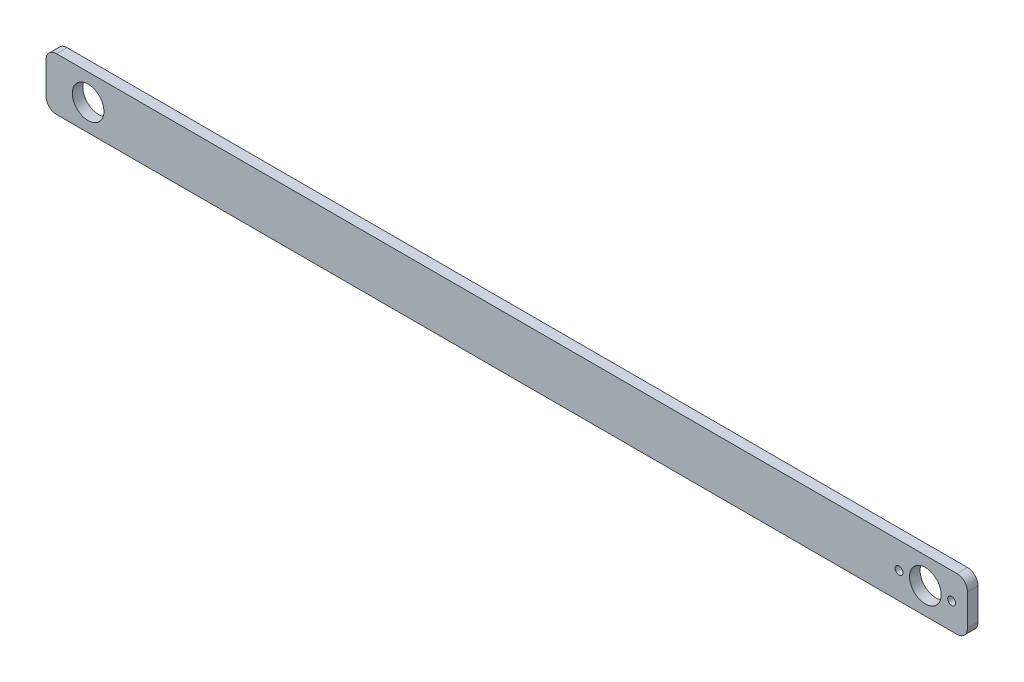
ISO-10303-21;
HEADER;
FILE_DESCRIPTION(('STEP AP214'),'2;1');
FILE_NAME('part.step','',(''),(''),'','','');
FILE_SCHEMA(('AUTOMOTIVE_DESIGN { 1 0 10303 214 1 1 1 1 }'));
ENDSEC;
DATA;
#1=APPLICATION_CONTEXT('core data for automotive mechanical design processes');
#2=APPLICATION_PROTOCOL_DEFINITION('international standard','automotive_design',2000,#1);
#3=PRODUCT_CONTEXT('',#1,'mechanical');
#4=PRODUCT('Part','Part','',(#3));
#5=PRODUCT_RELATED_PRODUCT_CATEGORY('part','',(#4));
#6=PRODUCT_DEFINITION_FORMATION('','',#4);
#7=PRODUCT_DEFINITION_CONTEXT('part definition',#1,'design');
#8=PRODUCT_DEFINITION('design','',#6,#7);
#9=PRODUCT_DEFINITION_SHAPE('','',#8);
#10=(LENGTH_UNIT() NAMED_UNIT(*) SI_UNIT(.MILLI.,.METRE.));
#11=(NAMED_UNIT(*) PLANE_ANGLE_UNIT() SI_UNIT($,.RADIAN.));
#12=(NAMED_UNIT(*) SI_UNIT($,.STERADIAN.) SOLID_ANGLE_UNIT());
#13=UNCERTAINTY_MEASURE_WITH_UNIT(LENGTH_MEASURE(1.E-05),#10,'distance_accuracy_value','');
#14=(GEOMETRIC_REPRESENTATION_CONTEXT(3) GLOBAL_UNCERTAINTY_ASSIGNED_CONTEXT((#13)) GLOBAL_UNIT_ASSIGNED_CONTEXT((#10,
#11,#12)) REPRESENTATION_CONTEXT('',''));
#15=CARTESIAN_POINT('',(0.,0.,0.));
#16=DIRECTION('',(0.,0.,1.));
#17=DIRECTION('',(1.,0.,0.));
#18=AXIS2_PLACEMENT_3D('',#15,#16,#17);
#19=CARTESIAN_POINT('',(-170.,-1.04083408558608E-13,2.));
#20=DIRECTION('',(1.,0.,0.));
#21=DIRECTION('',(0.,0.,-1.));
#22=AXIS2_PLACEMENT_3D('',#19,#20,#21);
#23=PLANE('',#22);
#24=DIRECTION('',(0.,-1.,0.));
#25=VECTOR('',#24,1.);
#26=CARTESIAN_POINT('',(-170.,-1.04083408558608E-13,0.));
#27=LINE('',#26,#25);
#28=CARTESIAN_POINT('',(-170.,-2.0000000000001,0.));
#29=VERTEX_POINT('',#28);
#30=CARTESIAN_POINT('',(-170.,-8.00000000000011,0.));
#31=VERTEX_POINT('',#30);
#32=EDGE_CURVE('E201',#29,#31,#27,.T.);
#33=ORIENTED_EDGE('',*,*,#32,.T.);
#34=DIRECTION('',(0.,0.,-1.));
#35=VECTOR('',#34,1.);
#36=CARTESIAN_POINT('',(-170.,-8.00000000000011,2.));
#37=LINE('',#36,#35);
#38=CARTESIAN_POINT('',(-170.,-8.00000000000011,2.));
#39=VERTEX_POINT('',#38);
#40=EDGE_CURVE('E11',#31,#39,#37,.F.);
#41=ORIENTED_EDGE('',*,*,#40,.T.);
#42=DIRECTION('',(0.,-1.,0.));
#43=VECTOR('',#42,1.);
#44=CARTESIAN_POINT('',(-170.,-1.04083408558608E-13,2.));
#45=LINE('',#44,#43);
#46=CARTESIAN_POINT('',(-170.,-2.0000000000001,2.));
#47=VERTEX_POINT('',#46);
#48=EDGE_CURVE('E134',#47,#39,#45,.T.);
#49=ORIENTED_EDGE('',*,*,#48,.F.);
#50=DIRECTION('',(0.,0.,-1.));
#51=VECTOR('',#50,1.);
#52=CARTESIAN_POINT('',(-170.,-2.0000000000001,2.));
#53=LINE('',#52,#51);
#54=EDGE_CURVE('E47',#47,#29,#53,.T.);
#55=ORIENTED_EDGE('',*,*,#54,.T.);
#56=EDGE_LOOP('',(#33,#41,#49,#55));
#57=FACE_BOUND('',#56,.T.);
#58=ADVANCED_FACE('F38',(#57),#23,.F.);
#59=CARTESIAN_POINT('',(-170.,-10.0000000000001,2.));
#60=DIRECTION('',(0.,1.,0.));
#61=DIRECTION('',(-1.,0.,0.));
#62=AXIS2_PLACEMENT_3D('',#59,#60,#61);
#63=PLANE('',#62);
#64=DIRECTION('',(1.,0.,0.));
#65=VECTOR('',#64,1.);
#66=CARTESIAN_POINT('',(-170.,-10.0000000000001,0.));
#67=LINE('',#66,#65);
#68=CARTESIAN_POINT('',(-168.,-10.0000000000001,0.));
#69=VERTEX_POINT('',#68);
#70=CARTESIAN_POINT('',(2.99999999999998,-10.0000000000001,0.));
#71=VERTEX_POINT('',#70);
#72=EDGE_CURVE('E142',#69,#71,#67,.T.);
#73=ORIENTED_EDGE('',*,*,#72,.T.);
#74=DIRECTION('',(0.,0.,-1.));
#75=VECTOR('',#74,1.);
#76=CARTESIAN_POINT('',(2.99999999999998,-10.0000000000001,2.));
#77=LINE('',#76,#75);
#78=CARTESIAN_POINT('',(2.99999999999998,-10.0000000000001,2.));
#79=VERTEX_POINT('',#78);
#80=EDGE_CURVE('E54',#71,#79,#77,.F.);
#81=ORIENTED_EDGE('',*,*,#80,.T.);
#82=DIRECTION('',(1.,0.,0.));
#83=VECTOR('',#82,1.);
#84=CARTESIAN_POINT('',(-170.,-10.0000000000001,2.));
#85=LINE('',#84,#83);
#86=CARTESIAN_POINT('',(-168.,-10.0000000000001,2.));
#87=VERTEX_POINT('',#86);
#88=EDGE_CURVE('E140',#87,#79,#85,.T.);
#89=ORIENTED_EDGE('',*,*,#88,.F.);
#90=DIRECTION('',(0.,0.,-1.));
#91=VECTOR('',#90,1.);
#92=CARTESIAN_POINT('',(-168.,-10.0000000000001,2.));
#93=LINE('',#92,#91);
#94=EDGE_CURVE('E189',#87,#69,#93,.T.);
#95=ORIENTED_EDGE('',*,*,#94,.T.);
#96=EDGE_LOOP('',(#73,#81,#89,#95));
#97=FACE_BOUND('',#96,.T.);
#98=ADVANCED_FACE('F253',(#97),#63,.F.);
#99=CARTESIAN_POINT('',(4.99999999999997,0.,2.));
#100=DIRECTION('',(-1.,0.,0.));
#101=DIRECTION('',(0.,-1.,0.));
#102=AXIS2_PLACEMENT_3D('',#99,#100,#101);
#103=PLANE('',#102);
#104=DIRECTION('',(0.,1.,0.));
#105=VECTOR('',#104,1.);
#106=CARTESIAN_POINT('',(4.99999999999997,0.,0.));
#107=LINE('',#106,#105);
#108=CARTESIAN_POINT('',(4.99999999999998,-8.00000000000005,0.));
#109=VERTEX_POINT('',#108);
#110=CARTESIAN_POINT('',(4.99999999999998,-2.00000000000005,0.));
#111=VERTEX_POINT('',#110);
#112=EDGE_CURVE('E135',#109,#111,#107,.T.);
#113=ORIENTED_EDGE('',*,*,#112,.T.);
#114=DIRECTION('',(0.,0.,-1.));
#115=VECTOR('',#114,1.);
#116=CARTESIAN_POINT('',(4.99999999999998,-2.00000000000005,2.));
#117=LINE('',#116,#115);
#118=CARTESIAN_POINT('',(4.99999999999998,-2.00000000000005,2.));
#119=VERTEX_POINT('',#118);
#120=EDGE_CURVE('E110',#111,#119,#117,.F.);
#121=ORIENTED_EDGE('',*,*,#120,.T.);
#122=DIRECTION('',(0.,1.,0.));
#123=VECTOR('',#122,1.);
#124=CARTESIAN_POINT('',(4.99999999999997,0.,2.));
#125=LINE('',#124,#123);
#126=CARTESIAN_POINT('',(4.99999999999998,-8.00000000000005,2.));
#127=VERTEX_POINT('',#126);
#128=EDGE_CURVE('E216',#127,#119,#125,.T.);
#129=ORIENTED_EDGE('',*,*,#128,.F.);
#130=DIRECTION('',(0.,0.,-1.));
#131=VECTOR('',#130,1.);
#132=CARTESIAN_POINT('',(4.99999999999998,-8.00000000000005,2.));
#133=LINE('',#132,#131);
#134=EDGE_CURVE('E116',#127,#109,#133,.T.);
#135=ORIENTED_EDGE('',*,*,#134,.T.);
#136=EDGE_LOOP('',(#113,#121,#129,#135));
#137=FACE_BOUND('',#136,.T.);
#138=ADVANCED_FACE('F250',(#137),#103,.F.);
#139=CARTESIAN_POINT('',(-170.,-1.04083408558608E-13,2.));
#140=DIRECTION('',(0.,-1.,0.));
#141=DIRECTION('',(1.,0.,0.));
#142=AXIS2_PLACEMENT_3D('',#139,#140,#141);
#143=PLANE('',#142);
#144=DIRECTION('',(-1.,0.,0.));
#145=VECTOR('',#144,1.);
#146=CARTESIAN_POINT('',(-170.,-1.04083408558608E-13,2.));
#147=LINE('',#146,#145);
#148=CARTESIAN_POINT('',(2.99999999999998,0.,2.));
#149=VERTEX_POINT('',#148);
#150=CARTESIAN_POINT('',(-168.,-1.03468820812834E-13,2.));
#151=VERTEX_POINT('',#150);
#152=EDGE_CURVE('E126',#149,#151,#147,.T.);
#153=ORIENTED_EDGE('',*,*,#152,.F.);
#154=DIRECTION('',(0.,0.,-1.));
#155=VECTOR('',#154,1.);
#156=CARTESIAN_POINT('',(2.99999999999998,0.,2.));
#157=LINE('',#156,#155);
#158=CARTESIAN_POINT('',(2.99999999999998,0.,0.));
#159=VERTEX_POINT('',#158);
#160=EDGE_CURVE('E109',#149,#159,#157,.T.);
#161=ORIENTED_EDGE('',*,*,#160,.T.);
#162=DIRECTION('',(-1.,0.,0.));
#163=VECTOR('',#162,1.);
#164=CARTESIAN_POINT('',(-170.,-1.04083408558608E-13,0.));
#165=LINE('',#164,#163);
#166=CARTESIAN_POINT('',(-168.,-1.03468820812834E-13,0.));
#167=VERTEX_POINT('',#166);
#168=EDGE_CURVE('E123',#159,#167,#165,.T.);
#169=ORIENTED_EDGE('',*,*,#168,.T.);
#170=DIRECTION('',(0.,0.,-1.));
#171=VECTOR('',#170,1.);
#172=CARTESIAN_POINT('',(-168.,-1.03468820812834E-13,2.));
#173=LINE('',#172,#171);
#174=EDGE_CURVE('E129',#167,#151,#173,.F.);
#175=ORIENTED_EDGE('',*,*,#174,.T.);
#176=EDGE_LOOP('',(#153,#161,#169,#175));
#177=FACE_BOUND('',#176,.T.);
#178=ADVANCED_FACE('F122',(#177),#143,.F.);
#179=CARTESIAN_POINT('',(0.,0.,2.));
#180=DIRECTION('',(0.,0.,1.));
#181=DIRECTION('',(1.,0.,0.));
#182=AXIS2_PLACEMENT_3D('',#179,#180,#181);
#183=PLANE('',#182);
#184=CARTESIAN_POINT('',(1.99999999999998,-5.00000000000006,2.));
#185=DIRECTION('',(0.,0.,1.));
#186=DIRECTION('',(1.,0.,0.));
#187=AXIS2_PLACEMENT_3D('',#184,#185,#186);
#188=CIRCLE('',#187,0.75);
#189=CARTESIAN_POINT('',(2.74999999999998,-5.00000000000006,2.));
#190=VERTEX_POINT('',#189);
#191=EDGE_CURVE('E226',#190,#190,#188,.T.);
#192=ORIENTED_EDGE('',*,*,#191,.F.);
#193=EDGE_LOOP('',(#192));
#194=FACE_BOUND('',#193,.T.);
#195=CARTESIAN_POINT('',(-8.00000000000002,-5.00000000000006,2.));
#196=DIRECTION('',(0.,0.,1.));
#197=DIRECTION('',(1.,0.,0.));
#198=AXIS2_PLACEMENT_3D('',#195,#196,#197);
#199=CIRCLE('',#198,0.75);
#200=CARTESIAN_POINT('',(-7.25000000000002,-5.00000000000006,2.));
#201=VERTEX_POINT('',#200);
#202=EDGE_CURVE('E225',#201,#201,#199,.T.);
#203=ORIENTED_EDGE('',*,*,#202,.F.);
#204=EDGE_LOOP('',(#203));
#205=FACE_BOUND('',#204,.T.);
#206=CARTESIAN_POINT('',(-3.00000000000002,-5.00000000000006,2.));
#207=DIRECTION('',(0.,0.,1.));
#208=DIRECTION('',(1.,0.,0.));
#209=AXIS2_PLACEMENT_3D('',#206,#207,#208);
#210=CIRCLE('',#209,3.);
#211=CARTESIAN_POINT('',(0.,-5.00000000000006,2.));
#212=VERTEX_POINT('',#211);
#213=EDGE_CURVE('E157',#212,#212,#210,.T.);
#214=ORIENTED_EDGE('',*,*,#213,.F.);
#215=EDGE_LOOP('',(#214));
#216=FACE_BOUND('',#215,.T.);
#217=CARTESIAN_POINT('',(-162.,-5.0000000000001,2.));
#218=DIRECTION('',(0.,0.,1.));
#219=DIRECTION('',(1.,0.,0.));
#220=AXIS2_PLACEMENT_3D('',#217,#218,#219);
#221=CIRCLE('',#220,2.99999999999999);
#222=CARTESIAN_POINT('',(-159.,-5.0000000000001,2.));
#223=VERTEX_POINT('',#222);
#224=EDGE_CURVE('E150',#223,#223,#221,.F.);
#225=ORIENTED_EDGE('',*,*,#224,.T.);
#226=EDGE_LOOP('',(#225));
#227=FACE_BOUND('',#226,.T.);
#228=ORIENTED_EDGE('',*,*,#128,.T.);
#229=CARTESIAN_POINT('',(2.99999999999998,-2.00000000000005,2.));
#230=DIRECTION('',(0.,0.,1.));
#231=DIRECTION('',(1.,0.,0.));
#232=AXIS2_PLACEMENT_3D('',#229,#230,#231);
#233=CIRCLE('',#232,2.);
#234=EDGE_CURVE('E186',#119,#149,#233,.T.);
#235=ORIENTED_EDGE('',*,*,#234,.T.);
#236=ORIENTED_EDGE('',*,*,#152,.T.);
#237=CARTESIAN_POINT('',(-168.,-2.0000000000001,2.));
#238=DIRECTION('',(0.,0.,1.));
#239=DIRECTION('',(1.,0.,0.));
#240=AXIS2_PLACEMENT_3D('',#237,#238,#239);
#241=CIRCLE('',#240,2.);
#242=EDGE_CURVE('E178',#151,#47,#241,.T.);
#243=ORIENTED_EDGE('',*,*,#242,.T.);
#244=ORIENTED_EDGE('',*,*,#48,.T.);
#245=CARTESIAN_POINT('',(-168.,-8.00000000000011,2.));
#246=DIRECTION('',(0.,0.,1.));
#247=DIRECTION('',(1.,0.,0.));
#248=AXIS2_PLACEMENT_3D('',#245,#246,#247);
#249=CIRCLE('',#248,2.);
#250=EDGE_CURVE('E61',#39,#87,#249,.T.);
#251=ORIENTED_EDGE('',*,*,#250,.T.);
#252=ORIENTED_EDGE('',*,*,#88,.T.);
#253=CARTESIAN_POINT('',(2.99999999999998,-8.00000000000005,2.));
#254=DIRECTION('',(0.,0.,1.));
#255=DIRECTION('',(1.,0.,0.));
#256=AXIS2_PLACEMENT_3D('',#253,#254,#255);
#257=CIRCLE('',#256,2.);
#258=EDGE_CURVE('E183',#79,#127,#257,.T.);
#259=ORIENTED_EDGE('',*,*,#258,.T.);
#260=EDGE_LOOP('',(#228,#235,#236,#243,#244,#251,#252,#259));
#261=FACE_BOUND('',#260,.T.);
#262=ADVANCED_FACE('F238',(#194,#205,#216,#227,#261),#183,.T.);
#263=CARTESIAN_POINT('',(0.,0.,0.));
#264=DIRECTION('',(0.,0.,1.));
#265=DIRECTION('',(1.,0.,0.));
#266=AXIS2_PLACEMENT_3D('',#263,#264,#265);
#267=PLANE('',#266);
#268=CARTESIAN_POINT('',(1.99999999999998,-5.00000000000006,0.));
#269=DIRECTION('',(0.,0.,1.));
#270=DIRECTION('',(1.,0.,0.));
#271=AXIS2_PLACEMENT_3D('',#268,#269,#270);
#272=CIRCLE('',#271,0.75);
#273=CARTESIAN_POINT('',(2.74999999999998,-5.00000000000006,0.));
#274=VERTEX_POINT('',#273);
#275=EDGE_CURVE('E151',#274,#274,#272,.T.);
#276=ORIENTED_EDGE('',*,*,#275,.T.);
#277=EDGE_LOOP('',(#276));
#278=FACE_BOUND('',#277,.T.);
#279=CARTESIAN_POINT('',(-8.00000000000002,-5.00000000000006,0.));
#280=DIRECTION('',(0.,0.,1.));
#281=DIRECTION('',(1.,0.,0.));
#282=AXIS2_PLACEMENT_3D('',#279,#280,#281);
#283=CIRCLE('',#282,0.75);
#284=CARTESIAN_POINT('',(-7.25000000000002,-5.00000000000006,0.));
#285=VERTEX_POINT('',#284);
#286=EDGE_CURVE('E156',#285,#285,#283,.T.);
#287=ORIENTED_EDGE('',*,*,#286,.T.);
#288=EDGE_LOOP('',(#287));
#289=FACE_BOUND('',#288,.T.);
#290=CARTESIAN_POINT('',(-3.00000000000002,-5.00000000000006,0.));
#291=DIRECTION('',(0.,0.,1.));
#292=DIRECTION('',(1.,0.,0.));
#293=AXIS2_PLACEMENT_3D('',#290,#291,#292);
#294=CIRCLE('',#293,3.);
#295=CARTESIAN_POINT('',(0.,-5.00000000000006,0.));
#296=VERTEX_POINT('',#295);
#297=EDGE_CURVE('E152',#296,#296,#294,.T.);
#298=ORIENTED_EDGE('',*,*,#297,.T.);
#299=EDGE_LOOP('',(#298));
#300=FACE_BOUND('',#299,.T.);
#301=CARTESIAN_POINT('',(-162.,-5.0000000000001,0.));
#302=DIRECTION('',(0.,0.,1.));
#303=DIRECTION('',(1.,0.,0.));
#304=AXIS2_PLACEMENT_3D('',#301,#302,#303);
#305=CIRCLE('',#304,2.99999999999999);
#306=CARTESIAN_POINT('',(-159.,-5.0000000000001,0.));
#307=VERTEX_POINT('',#306);
#308=EDGE_CURVE('E146',#307,#307,#305,.F.);
#309=ORIENTED_EDGE('',*,*,#308,.F.);
#310=EDGE_LOOP('',(#309));
#311=FACE_BOUND('',#310,.T.);
#312=ORIENTED_EDGE('',*,*,#168,.F.);
#313=CARTESIAN_POINT('',(2.99999999999998,-2.00000000000005,0.));
#314=DIRECTION('',(0.,0.,1.));
#315=DIRECTION('',(1.,0.,0.));
#316=AXIS2_PLACEMENT_3D('',#313,#314,#315);
#317=CIRCLE('',#316,2.);
#318=EDGE_CURVE('E105',#159,#111,#317,.F.);
#319=ORIENTED_EDGE('',*,*,#318,.T.);
#320=ORIENTED_EDGE('',*,*,#112,.F.);
#321=CARTESIAN_POINT('',(2.99999999999998,-8.00000000000005,0.));
#322=DIRECTION('',(0.,0.,1.));
#323=DIRECTION('',(1.,0.,0.));
#324=AXIS2_PLACEMENT_3D('',#321,#322,#323);
#325=CIRCLE('',#324,2.);
#326=EDGE_CURVE('E117',#109,#71,#325,.F.);
#327=ORIENTED_EDGE('',*,*,#326,.T.);
#328=ORIENTED_EDGE('',*,*,#72,.F.);
#329=CARTESIAN_POINT('',(-168.,-8.00000000000011,0.));
#330=DIRECTION('',(0.,0.,1.));
#331=DIRECTION('',(1.,0.,0.));
#332=AXIS2_PLACEMENT_3D('',#329,#330,#331);
#333=CIRCLE('',#332,2.);
#334=EDGE_CURVE('E168',#69,#31,#333,.F.);
#335=ORIENTED_EDGE('',*,*,#334,.T.);
#336=ORIENTED_EDGE('',*,*,#32,.F.);
#337=CARTESIAN_POINT('',(-168.,-2.0000000000001,0.));
#338=DIRECTION('',(0.,0.,1.));
#339=DIRECTION('',(1.,0.,0.));
#340=AXIS2_PLACEMENT_3D('',#337,#338,#339);
#341=CIRCLE('',#340,2.);
#342=EDGE_CURVE('E128',#29,#167,#341,.F.);
#343=ORIENTED_EDGE('',*,*,#342,.T.);
#344=EDGE_LOOP('',(#312,#319,#320,#327,#328,#335,#336,#343));
#345=FACE_BOUND('',#344,.T.);
#346=ADVANCED_FACE('F131',(#278,#289,#300,#311,#345),#267,.F.);
#347=CARTESIAN_POINT('',(-162.,-5.0000000000001,14.));
#348=DIRECTION('',(0.,0.,-1.));
#349=DIRECTION('',(-1.,0.,0.));
#350=AXIS2_PLACEMENT_3D('',#347,#348,#349);
#351=CYLINDRICAL_SURFACE('',#350,2.99999999999999);
#352=ORIENTED_EDGE('',*,*,#224,.F.);
#353=EDGE_LOOP('',(#352));
#354=FACE_BOUND('',#353,.T.);
#355=ORIENTED_EDGE('',*,*,#308,.T.);
#356=EDGE_LOOP('',(#355));
#357=FACE_BOUND('',#356,.T.);
#358=ADVANCED_FACE('F328',(#354,#357),#351,.F.);
#359=CARTESIAN_POINT('',(-3.00000000000002,-5.00000000000006,-8.));
#360=DIRECTION('',(0.,0.,1.));
#361=DIRECTION('',(1.,0.,0.));
#362=AXIS2_PLACEMENT_3D('',#359,#360,#361);
#363=CYLINDRICAL_SURFACE('',#362,3.);
#364=ORIENTED_EDGE('',*,*,#213,.T.);
#365=EDGE_LOOP('',(#364));
#366=FACE_BOUND('',#365,.T.);
#367=ORIENTED_EDGE('',*,*,#297,.F.);
#368=EDGE_LOOP('',(#367));
#369=FACE_BOUND('',#368,.T.);
#370=ADVANCED_FACE('F319',(#366,#369),#363,.F.);
#371=CARTESIAN_POINT('',(-8.00000000000002,-5.00000000000006,-8.));
#372=DIRECTION('',(0.,0.,1.));
#373=DIRECTION('',(1.,0.,0.));
#374=AXIS2_PLACEMENT_3D('',#371,#372,#373);
#375=CYLINDRICAL_SURFACE('',#374,0.75);
#376=ORIENTED_EDGE('',*,*,#202,.T.);
#377=EDGE_LOOP('',(#376));
#378=FACE_BOUND('',#377,.T.);
#379=ORIENTED_EDGE('',*,*,#286,.F.);
#380=EDGE_LOOP('',(#379));
#381=FACE_BOUND('',#380,.T.);
#382=ADVANCED_FACE('F235',(#378,#381),#375,.F.);
#383=CARTESIAN_POINT('',(1.99999999999998,-5.00000000000006,-8.));
#384=DIRECTION('',(0.,0.,1.));
#385=DIRECTION('',(1.,0.,0.));
#386=AXIS2_PLACEMENT_3D('',#383,#384,#385);
#387=CYLINDRICAL_SURFACE('',#386,0.75);
#388=ORIENTED_EDGE('',*,*,#191,.T.);
#389=EDGE_LOOP('',(#388));
#390=FACE_BOUND('',#389,.T.);
#391=ORIENTED_EDGE('',*,*,#275,.F.);
#392=EDGE_LOOP('',(#391));
#393=FACE_BOUND('',#392,.T.);
#394=ADVANCED_FACE('F271',(#390,#393),#387,.F.);
#395=CARTESIAN_POINT('',(2.99999999999998,-2.00000000000005,2.));
#396=DIRECTION('',(0.,0.,-1.));
#397=DIRECTION('',(-1.,0.,0.));
#398=AXIS2_PLACEMENT_3D('',#395,#396,#397);
#399=CYLINDRICAL_SURFACE('',#398,2.);
#400=ORIENTED_EDGE('',*,*,#234,.F.);
#401=ORIENTED_EDGE('',*,*,#120,.F.);
#402=ORIENTED_EDGE('',*,*,#318,.F.);
#403=ORIENTED_EDGE('',*,*,#160,.F.);
#404=EDGE_LOOP('',(#400,#401,#402,#403));
#405=FACE_BOUND('',#404,.T.);
#406=ADVANCED_FACE('F108',(#405),#399,.T.);
#407=CARTESIAN_POINT('',(2.99999999999998,-8.00000000000005,2.));
#408=DIRECTION('',(0.,0.,-1.));
#409=DIRECTION('',(-1.,0.,0.));
#410=AXIS2_PLACEMENT_3D('',#407,#408,#409);
#411=CYLINDRICAL_SURFACE('',#410,2.);
#412=ORIENTED_EDGE('',*,*,#258,.F.);
#413=ORIENTED_EDGE('',*,*,#80,.F.);
#414=ORIENTED_EDGE('',*,*,#326,.F.);
#415=ORIENTED_EDGE('',*,*,#134,.F.);
#416=EDGE_LOOP('',(#412,#413,#414,#415));
#417=FACE_BOUND('',#416,.T.);
#418=ADVANCED_FACE('F252',(#417),#411,.T.);
#419=CARTESIAN_POINT('',(-168.,-8.00000000000011,2.));
#420=DIRECTION('',(0.,0.,-1.));
#421=DIRECTION('',(-1.,0.,0.));
#422=AXIS2_PLACEMENT_3D('',#419,#420,#421);
#423=CYLINDRICAL_SURFACE('',#422,2.);
#424=ORIENTED_EDGE('',*,*,#250,.F.);
#425=ORIENTED_EDGE('',*,*,#40,.F.);
#426=ORIENTED_EDGE('',*,*,#334,.F.);
#427=ORIENTED_EDGE('',*,*,#94,.F.);
#428=EDGE_LOOP('',(#424,#425,#426,#427));
#429=FACE_BOUND('',#428,.T.);
#430=ADVANCED_FACE('F256',(#429),#423,.T.);
#431=CARTESIAN_POINT('',(-168.,-2.0000000000001,2.));
#432=DIRECTION('',(0.,0.,-1.));
#433=DIRECTION('',(-1.,0.,0.));
#434=AXIS2_PLACEMENT_3D('',#431,#432,#433);
#435=CYLINDRICAL_SURFACE('',#434,2.);
#436=ORIENTED_EDGE('',*,*,#242,.F.);
#437=ORIENTED_EDGE('',*,*,#174,.F.);
#438=ORIENTED_EDGE('',*,*,#342,.F.);
#439=ORIENTED_EDGE('',*,*,#54,.F.);
#440=EDGE_LOOP('',(#436,#437,#438,#439));
#441=FACE_BOUND('',#440,.T.);
#442=ADVANCED_FACE('F40',(#441),#435,.T.);
#443=CLOSED_SHELL('',(#58,#98,#138,#178,#262,#346,#358,#370,#382,#394,#406,#418,#430,#442));
#444=MANIFOLD_SOLID_BREP('B2',#443);
#445=ADVANCED_BREP_SHAPE_REPRESENTATION('',(#18,#444),#14);
#446=SHAPE_DEFINITION_REPRESENTATION(#9,#445);
ENDSEC;
END-ISO-10303-21;
